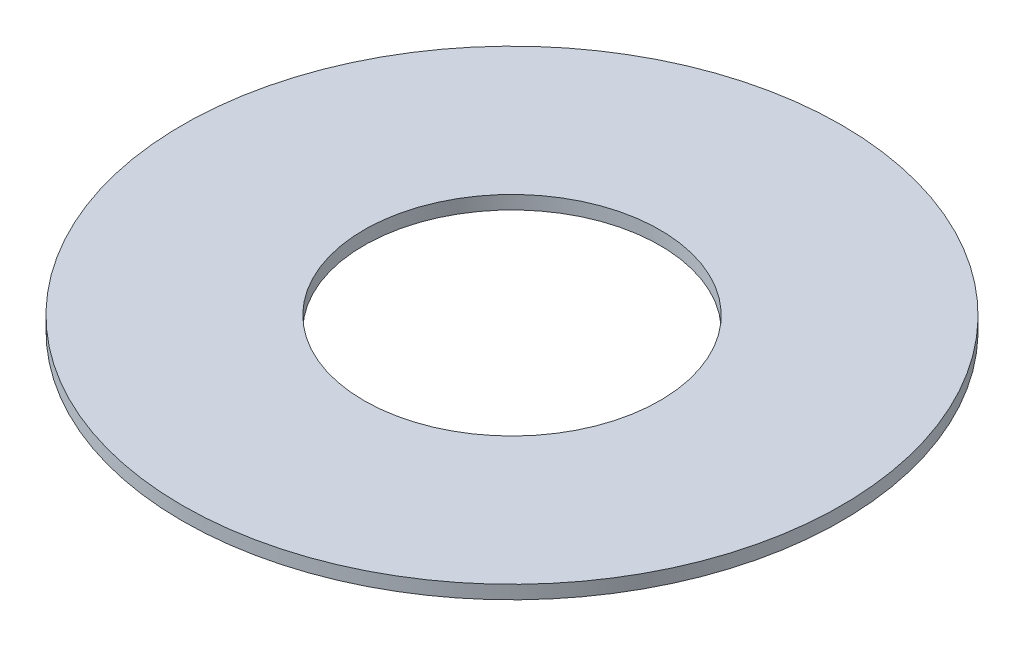
ISO-10303-21;
HEADER;
FILE_DESCRIPTION(('STEP AP214'),'2;1');
FILE_NAME('part.step','',(''),(''),'','','');
FILE_SCHEMA(('AUTOMOTIVE_DESIGN { 1 0 10303 214 1 1 1 1 }'));
ENDSEC;
DATA;
#1=APPLICATION_CONTEXT('core data for automotive mechanical design processes');
#2=APPLICATION_PROTOCOL_DEFINITION('international standard','automotive_design',2000,#1);
#3=PRODUCT_CONTEXT('',#1,'mechanical');
#4=PRODUCT('Part','Part','',(#3));
#5=PRODUCT_RELATED_PRODUCT_CATEGORY('part','',(#4));
#6=PRODUCT_DEFINITION_FORMATION('','',#4);
#7=PRODUCT_DEFINITION_CONTEXT('part definition',#1,'design');
#8=PRODUCT_DEFINITION('design','',#6,#7);
#9=PRODUCT_DEFINITION_SHAPE('','',#8);
#10=(LENGTH_UNIT() NAMED_UNIT(*) SI_UNIT(.MILLI.,.METRE.));
#11=(NAMED_UNIT(*) PLANE_ANGLE_UNIT() SI_UNIT($,.RADIAN.));
#12=(NAMED_UNIT(*) SI_UNIT($,.STERADIAN.) SOLID_ANGLE_UNIT());
#13=UNCERTAINTY_MEASURE_WITH_UNIT(LENGTH_MEASURE(1.E-05),#10,'distance_accuracy_value','');
#14=(GEOMETRIC_REPRESENTATION_CONTEXT(3) GLOBAL_UNCERTAINTY_ASSIGNED_CONTEXT((#13)) GLOBAL_UNIT_ASSIGNED_CONTEXT((#10,
#11,#12)) REPRESENTATION_CONTEXT('',''));
#15=CARTESIAN_POINT('',(0.,0.,0.));
#16=DIRECTION('',(0.,0.,1.));
#17=DIRECTION('',(1.,0.,0.));
#18=AXIS2_PLACEMENT_3D('',#15,#16,#17);
#19=CARTESIAN_POINT('',(0.,2.,0.));
#20=DIRECTION('',(0.,1.,0.));
#21=DIRECTION('',(0.,0.,1.));
#22=AXIS2_PLACEMENT_3D('',#19,#20,#21);
#23=PLANE('',#22);
#24=CARTESIAN_POINT('',(0.,2.,0.));
#25=DIRECTION('',(0.,1.,0.));
#26=DIRECTION('',(0.,0.,1.));
#27=AXIS2_PLACEMENT_3D('',#24,#25,#26);
#28=CIRCLE('',#27,49.);
#29=CARTESIAN_POINT('',(0.,2.,49.));
#30=VERTEX_POINT('',#29);
#31=EDGE_CURVE('E10',#30,#30,#28,.T.);
#32=ORIENTED_EDGE('',*,*,#31,.T.);
#33=EDGE_LOOP('',(#32));
#34=FACE_BOUND('',#33,.T.);
#35=CARTESIAN_POINT('',(0.,2.,0.));
#36=DIRECTION('',(0.,1.,0.));
#37=DIRECTION('',(0.,0.,1.));
#38=AXIS2_PLACEMENT_3D('',#35,#36,#37);
#39=CIRCLE('',#38,22.);
#40=CARTESIAN_POINT('',(0.,2.,22.));
#41=VERTEX_POINT('',#40);
#42=EDGE_CURVE('E42',#41,#41,#39,.T.);
#43=ORIENTED_EDGE('',*,*,#42,.F.);
#44=EDGE_LOOP('',(#43));
#45=FACE_BOUND('',#44,.T.);
#46=ADVANCED_FACE('F31',(#34,#45),#23,.T.);
#47=CARTESIAN_POINT('',(0.,0.,0.));
#48=DIRECTION('',(0.,1.,0.));
#49=DIRECTION('',(0.,0.,1.));
#50=AXIS2_PLACEMENT_3D('',#47,#48,#49);
#51=PLANE('',#50);
#52=CARTESIAN_POINT('',(0.,0.,0.));
#53=DIRECTION('',(0.,1.,0.));
#54=DIRECTION('',(0.,0.,1.));
#55=AXIS2_PLACEMENT_3D('',#52,#53,#54);
#56=CIRCLE('',#55,49.);
#57=CARTESIAN_POINT('',(0.,0.,49.));
#58=VERTEX_POINT('',#57);
#59=EDGE_CURVE('E35',#58,#58,#56,.T.);
#60=ORIENTED_EDGE('',*,*,#59,.F.);
#61=EDGE_LOOP('',(#60));
#62=FACE_BOUND('',#61,.T.);
#63=CARTESIAN_POINT('',(0.,0.,0.));
#64=DIRECTION('',(0.,1.,0.));
#65=DIRECTION('',(0.,0.,1.));
#66=AXIS2_PLACEMENT_3D('',#63,#64,#65);
#67=CIRCLE('',#66,22.);
#68=CARTESIAN_POINT('',(0.,0.,22.));
#69=VERTEX_POINT('',#68);
#70=EDGE_CURVE('E44',#69,#69,#67,.T.);
#71=ORIENTED_EDGE('',*,*,#70,.T.);
#72=EDGE_LOOP('',(#71));
#73=FACE_BOUND('',#72,.T.);
#74=ADVANCED_FACE('F54',(#62,#73),#51,.F.);
#75=CARTESIAN_POINT('',(0.,2.,0.));
#76=DIRECTION('',(0.,-1.,0.));
#77=DIRECTION('',(0.,0.,-1.));
#78=AXIS2_PLACEMENT_3D('',#75,#76,#77);
#79=CYLINDRICAL_SURFACE('',#78,49.);
#80=ORIENTED_EDGE('',*,*,#31,.F.);
#81=EDGE_LOOP('',(#80));
#82=FACE_BOUND('',#81,.T.);
#83=ORIENTED_EDGE('',*,*,#59,.T.);
#84=EDGE_LOOP('',(#83));
#85=FACE_BOUND('',#84,.T.);
#86=ADVANCED_FACE('F33',(#82,#85),#79,.T.);
#87=CARTESIAN_POINT('',(0.,2.,0.));
#88=DIRECTION('',(0.,-1.,0.));
#89=DIRECTION('',(0.,0.,-1.));
#90=AXIS2_PLACEMENT_3D('',#87,#88,#89);
#91=CYLINDRICAL_SURFACE('',#90,22.);
#92=ORIENTED_EDGE('',*,*,#42,.T.);
#93=EDGE_LOOP('',(#92));
#94=FACE_BOUND('',#93,.T.);
#95=ORIENTED_EDGE('',*,*,#70,.F.);
#96=EDGE_LOOP('',(#95));
#97=FACE_BOUND('',#96,.T.);
#98=ADVANCED_FACE('F50',(#94,#97),#91,.F.);
#99=CLOSED_SHELL('',(#46,#74,#86,#98));
#100=MANIFOLD_SOLID_BREP('B2',#99);
#101=ADVANCED_BREP_SHAPE_REPRESENTATION('',(#18,#100),#14);
#102=SHAPE_DEFINITION_REPRESENTATION(#9,#101);
ENDSEC;
END-ISO-10303-21;
